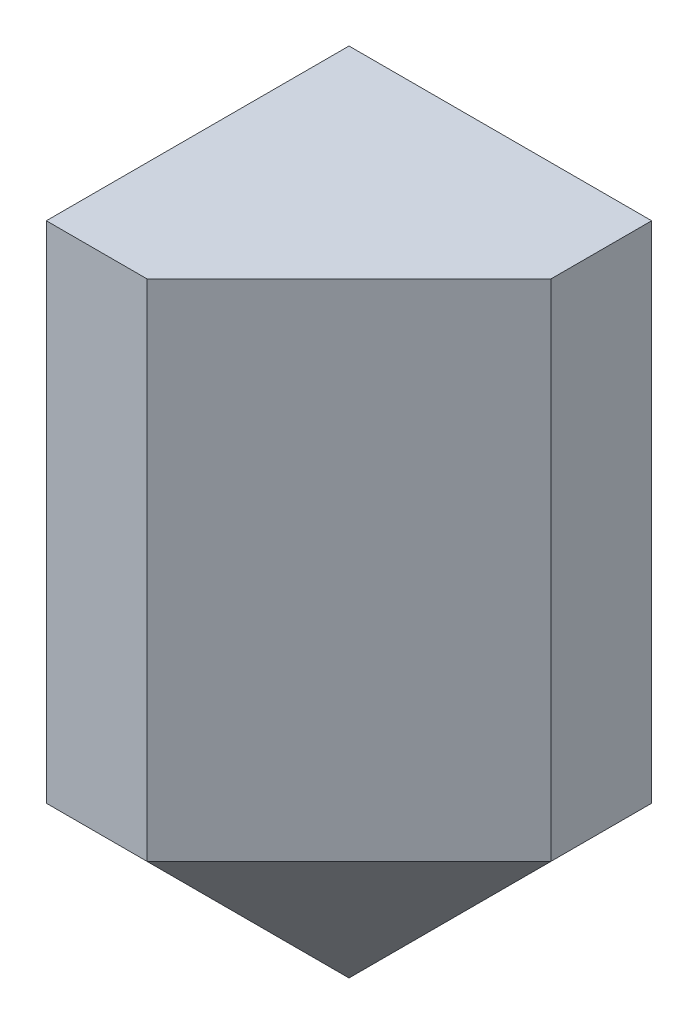
ISO-10303-21;
HEADER;
FILE_DESCRIPTION(('STEP AP214'),'2;1');
FILE_NAME('part.step','',(''),(''),'','','');
FILE_SCHEMA(('AUTOMOTIVE_DESIGN { 1 0 10303 214 1 1 1 1 }'));
ENDSEC;
DATA;
#1=APPLICATION_CONTEXT('core data for automotive mechanical design processes');
#2=APPLICATION_PROTOCOL_DEFINITION('international standard','automotive_design',2000,#1);
#3=PRODUCT_CONTEXT('',#1,'mechanical');
#4=PRODUCT('Part','Part','',(#3));
#5=PRODUCT_RELATED_PRODUCT_CATEGORY('part','',(#4));
#6=PRODUCT_DEFINITION_FORMATION('','',#4);
#7=PRODUCT_DEFINITION_CONTEXT('part definition',#1,'design');
#8=PRODUCT_DEFINITION('design','',#6,#7);
#9=PRODUCT_DEFINITION_SHAPE('','',#8);
#10=(LENGTH_UNIT() NAMED_UNIT(*) SI_UNIT(.MILLI.,.METRE.));
#11=(NAMED_UNIT(*) PLANE_ANGLE_UNIT() SI_UNIT($,.RADIAN.));
#12=(NAMED_UNIT(*) SI_UNIT($,.STERADIAN.) SOLID_ANGLE_UNIT());
#13=UNCERTAINTY_MEASURE_WITH_UNIT(LENGTH_MEASURE(1.E-05),#10,'distance_accuracy_value','');
#14=(GEOMETRIC_REPRESENTATION_CONTEXT(3) GLOBAL_UNCERTAINTY_ASSIGNED_CONTEXT((#13)) GLOBAL_UNIT_ASSIGNED_CONTEXT((#10,
#11,#12)) REPRESENTATION_CONTEXT('',''));
#15=CARTESIAN_POINT('',(0.,0.,0.));
#16=DIRECTION('',(0.,0.,1.));
#17=DIRECTION('',(1.,0.,0.));
#18=AXIS2_PLACEMENT_3D('',#15,#16,#17);
#19=CARTESIAN_POINT('',(0.,0.,30.));
#20=DIRECTION('',(1.,0.,0.));
#21=DIRECTION('',(0.,0.,-1.));
#22=AXIS2_PLACEMENT_3D('',#19,#20,#21);
#23=PLANE('',#22);
#24=CARTESIAN_POINT('',(0.,20.,18.));
#25=DIRECTION('',(-1.,0.,0.));
#26=DIRECTION('',(0.,0.,1.));
#27=AXIS2_PLACEMENT_3D('',#24,#25,#26);
#28=CIRCLE('',#27,2.75);
#29=CARTESIAN_POINT('',(0.,20.,20.75));
#30=VERTEX_POINT('',#29);
#31=EDGE_CURVE('E134',#30,#30,#28,.T.);
#32=ORIENTED_EDGE('',*,*,#31,.F.);
#33=EDGE_LOOP('',(#32));
#34=FACE_BOUND('',#33,.T.);
#35=CARTESIAN_POINT('',(0.,48.,18.));
#36=DIRECTION('',(-1.,0.,0.));
#37=DIRECTION('',(0.,0.,1.));
#38=AXIS2_PLACEMENT_3D('',#35,#36,#37);
#39=CIRCLE('',#38,2.75);
#40=CARTESIAN_POINT('',(0.,48.,20.75));
#41=VERTEX_POINT('',#40);
#42=EDGE_CURVE('E140',#41,#41,#39,.T.);
#43=ORIENTED_EDGE('',*,*,#42,.F.);
#44=EDGE_LOOP('',(#43));
#45=FACE_BOUND('',#44,.T.);
#46=DIRECTION('',(0.,0.,-1.));
#47=VECTOR('',#46,1.);
#48=CARTESIAN_POINT('',(0.,0.,30.));
#49=LINE('',#48,#47);
#50=CARTESIAN_POINT('',(0.,0.,9.99999999999995));
#51=VERTEX_POINT('',#50);
#52=CARTESIAN_POINT('',(0.,0.,0.));
#53=VERTEX_POINT('',#52);
#54=EDGE_CURVE('E165',#51,#53,#49,.T.);
#55=ORIENTED_EDGE('',*,*,#54,.F.);
#56=DIRECTION('',(0.,-0.707106781186546,-0.707106781186549));
#57=VECTOR('',#56,1.);
#58=CARTESIAN_POINT('',(0.,20.,30.));
#59=LINE('',#58,#57);
#60=CARTESIAN_POINT('',(0.,20.,30.));
#61=VERTEX_POINT('',#60);
#62=EDGE_CURVE('E11',#51,#61,#59,.F.);
#63=ORIENTED_EDGE('',*,*,#62,.T.);
#64=DIRECTION('',(0.,-1.,0.));
#65=VECTOR('',#64,1.);
#66=CARTESIAN_POINT('',(0.,0.,30.));
#67=LINE('',#66,#65);
#68=CARTESIAN_POINT('',(0.,70.,30.));
#69=VERTEX_POINT('',#68);
#70=EDGE_CURVE('E162',#69,#61,#67,.T.);
#71=ORIENTED_EDGE('',*,*,#70,.F.);
#72=DIRECTION('',(0.,0.,1.));
#73=VECTOR('',#72,1.);
#74=CARTESIAN_POINT('',(0.,70.,30.));
#75=LINE('',#74,#73);
#76=CARTESIAN_POINT('',(0.,70.,0.));
#77=VERTEX_POINT('',#76);
#78=EDGE_CURVE('E146',#77,#69,#75,.T.);
#79=ORIENTED_EDGE('',*,*,#78,.F.);
#80=DIRECTION('',(0.,-1.,0.));
#81=VECTOR('',#80,1.);
#82=CARTESIAN_POINT('',(0.,0.,0.));
#83=LINE('',#82,#81);
#84=EDGE_CURVE('E167',#77,#53,#83,.T.);
#85=ORIENTED_EDGE('',*,*,#84,.T.);
#86=EDGE_LOOP('',(#55,#63,#71,#79,#85));
#87=FACE_BOUND('',#86,.T.);
#88=ADVANCED_FACE('F41',(#34,#45,#87),#23,.F.);
#89=CARTESIAN_POINT('',(0.,0.,30.));
#90=DIRECTION('',(0.,1.,0.));
#91=DIRECTION('',(0.,0.,1.));
#92=AXIS2_PLACEMENT_3D('',#89,#90,#91);
#93=PLANE('',#92);
#94=DIRECTION('',(1.,0.,0.));
#95=VECTOR('',#94,1.);
#96=CARTESIAN_POINT('',(0.,0.,0.));
#97=LINE('',#96,#95);
#98=CARTESIAN_POINT('',(9.99999999999995,0.,0.));
#99=VERTEX_POINT('',#98);
#100=EDGE_CURVE('E170',#53,#99,#97,.T.);
#101=ORIENTED_EDGE('',*,*,#100,.T.);
#102=DIRECTION('',(0.,0.,1.));
#103=VECTOR('',#102,1.);
#104=CARTESIAN_POINT('',(9.99999999999995,0.,30.));
#105=LINE('',#104,#103);
#106=CARTESIAN_POINT('',(9.99999999999995,0.,9.99999999999995));
#107=VERTEX_POINT('',#106);
#108=EDGE_CURVE('E51',#99,#107,#105,.T.);
#109=ORIENTED_EDGE('',*,*,#108,.T.);
#110=DIRECTION('',(-1.,0.,0.));
#111=VECTOR('',#110,1.);
#112=CARTESIAN_POINT('',(0.,0.,9.99999999999995));
#113=LINE('',#112,#111);
#114=EDGE_CURVE('E62',#107,#51,#113,.T.);
#115=ORIENTED_EDGE('',*,*,#114,.T.);
#116=ORIENTED_EDGE('',*,*,#54,.T.);
#117=EDGE_LOOP('',(#101,#109,#115,#116));
#118=FACE_BOUND('',#117,.T.);
#119=ADVANCED_FACE('F223',(#118),#93,.F.);
#120=CARTESIAN_POINT('',(30.,0.,30.));
#121=DIRECTION('',(-1.,0.,0.));
#122=DIRECTION('',(0.,0.,1.));
#123=AXIS2_PLACEMENT_3D('',#120,#121,#122);
#124=PLANE('',#123);
#125=DIRECTION('',(0.,1.,0.));
#126=VECTOR('',#125,1.);
#127=CARTESIAN_POINT('',(30.,0.,0.));
#128=LINE('',#127,#126);
#129=CARTESIAN_POINT('',(30.,20.,0.));
#130=VERTEX_POINT('',#129);
#131=CARTESIAN_POINT('',(30.,70.,0.));
#132=VERTEX_POINT('',#131);
#133=EDGE_CURVE('E166',#130,#132,#128,.T.);
#134=ORIENTED_EDGE('',*,*,#133,.T.);
#135=DIRECTION('',(0.,0.,-1.));
#136=VECTOR('',#135,1.);
#137=CARTESIAN_POINT('',(30.,70.,0.));
#138=LINE('',#137,#136);
#139=CARTESIAN_POINT('',(30.,70.,9.99999999999992));
#140=VERTEX_POINT('',#139);
#141=EDGE_CURVE('E155',#140,#132,#138,.T.);
#142=ORIENTED_EDGE('',*,*,#141,.F.);
#143=DIRECTION('',(0.,-1.,0.));
#144=VECTOR('',#143,1.);
#145=CARTESIAN_POINT('',(30.,0.,9.99999999999995));
#146=LINE('',#145,#144);
#147=CARTESIAN_POINT('',(30.,20.,9.99999999999995));
#148=VERTEX_POINT('',#147);
#149=EDGE_CURVE('E180',#140,#148,#146,.T.);
#150=ORIENTED_EDGE('',*,*,#149,.T.);
#151=DIRECTION('',(0.,0.,-1.));
#152=VECTOR('',#151,1.);
#153=CARTESIAN_POINT('',(30.,20.,30.));
#154=LINE('',#153,#152);
#155=EDGE_CURVE('E178',#148,#130,#154,.T.);
#156=ORIENTED_EDGE('',*,*,#155,.T.);
#157=EDGE_LOOP('',(#134,#142,#150,#156));
#158=FACE_BOUND('',#157,.T.);
#159=ADVANCED_FACE('F229',(#158),#124,.F.);
#160=CARTESIAN_POINT('',(0.,0.,30.));
#161=DIRECTION('',(0.,0.,-1.));
#162=DIRECTION('',(-1.,0.,0.));
#163=AXIS2_PLACEMENT_3D('',#160,#161,#162);
#164=PLANE('',#163);
#165=DIRECTION('',(1.,0.,0.));
#166=VECTOR('',#165,1.);
#167=CARTESIAN_POINT('',(0.,20.,30.));
#168=LINE('',#167,#166);
#169=CARTESIAN_POINT('',(10.,20.,30.));
#170=VERTEX_POINT('',#169);
#171=EDGE_CURVE('E174',#61,#170,#168,.T.);
#172=ORIENTED_EDGE('',*,*,#171,.T.);
#173=DIRECTION('',(0.,1.,0.));
#174=VECTOR('',#173,1.);
#175=CARTESIAN_POINT('',(10.,0.,30.));
#176=LINE('',#175,#174);
#177=CARTESIAN_POINT('',(9.99999999999999,70.,30.));
#178=VERTEX_POINT('',#177);
#179=EDGE_CURVE('E176',#170,#178,#176,.T.);
#180=ORIENTED_EDGE('',*,*,#179,.T.);
#181=DIRECTION('',(1.,0.,0.));
#182=VECTOR('',#181,1.);
#183=CARTESIAN_POINT('',(9.99999999999999,70.,30.));
#184=LINE('',#183,#182);
#185=EDGE_CURVE('E149',#69,#178,#184,.T.);
#186=ORIENTED_EDGE('',*,*,#185,.F.);
#187=ORIENTED_EDGE('',*,*,#70,.T.);
#188=EDGE_LOOP('',(#172,#180,#186,#187));
#189=FACE_BOUND('',#188,.T.);
#190=ADVANCED_FACE('F203',(#189),#164,.F.);
#191=CARTESIAN_POINT('',(0.,0.,0.));
#192=DIRECTION('',(0.,0.,-1.));
#193=DIRECTION('',(-1.,0.,0.));
#194=AXIS2_PLACEMENT_3D('',#191,#192,#193);
#195=PLANE('',#194);
#196=CARTESIAN_POINT('',(15.,55.,0.));
#197=DIRECTION('',(0.,0.,-1.));
#198=DIRECTION('',(-1.,0.,0.));
#199=AXIS2_PLACEMENT_3D('',#196,#197,#198);
#200=CIRCLE('',#199,7.5);
#201=CARTESIAN_POINT('',(7.5,55.,0.));
#202=VERTEX_POINT('',#201);
#203=EDGE_CURVE('E117',#202,#202,#200,.T.);
#204=ORIENTED_EDGE('',*,*,#203,.F.);
#205=EDGE_LOOP('',(#204));
#206=FACE_BOUND('',#205,.T.);
#207=CARTESIAN_POINT('',(18.,20.,0.));
#208=DIRECTION('',(0.,0.,-1.));
#209=DIRECTION('',(-1.,0.,0.));
#210=AXIS2_PLACEMENT_3D('',#207,#208,#209);
#211=CIRCLE('',#210,2.74999999999999);
#212=CARTESIAN_POINT('',(15.25,20.,0.));
#213=VERTEX_POINT('',#212);
#214=EDGE_CURVE('E127',#213,#213,#211,.T.);
#215=ORIENTED_EDGE('',*,*,#214,.F.);
#216=EDGE_LOOP('',(#215));
#217=FACE_BOUND('',#216,.T.);
#218=ORIENTED_EDGE('',*,*,#133,.F.);
#219=DIRECTION('',(0.707106781186549,0.707106781186546,0.));
#220=VECTOR('',#219,1.);
#221=CARTESIAN_POINT('',(4.99999999999996,-4.99999999999997,0.));
#222=LINE('',#221,#220);
#223=EDGE_CURVE('E182',#130,#99,#222,.F.);
#224=ORIENTED_EDGE('',*,*,#223,.T.);
#225=ORIENTED_EDGE('',*,*,#100,.F.);
#226=ORIENTED_EDGE('',*,*,#84,.F.);
#227=DIRECTION('',(-1.,0.,0.));
#228=VECTOR('',#227,1.);
#229=CARTESIAN_POINT('',(0.,70.,0.));
#230=LINE('',#229,#228);
#231=EDGE_CURVE('E158',#132,#77,#230,.T.);
#232=ORIENTED_EDGE('',*,*,#231,.F.);
#233=EDGE_LOOP('',(#218,#224,#225,#226,#232));
#234=FACE_BOUND('',#233,.T.);
#235=ADVANCED_FACE('F220',(#206,#217,#234),#195,.T.);
#236=CARTESIAN_POINT('',(30.,20.,30.));
#237=DIRECTION('',(-0.707106781186546,0.707106781186549,0.));
#238=DIRECTION('',(0.,0.,-1.));
#239=AXIS2_PLACEMENT_3D('',#236,#237,#238);
#240=PLANE('',#239);
#241=ORIENTED_EDGE('',*,*,#223,.F.);
#242=ORIENTED_EDGE('',*,*,#155,.F.);
#243=DIRECTION('',(-0.707106781186549,-0.707106781186546,0.));
#244=VECTOR('',#243,1.);
#245=CARTESIAN_POINT('',(30.,20.,9.99999999999995));
#246=LINE('',#245,#244);
#247=EDGE_CURVE('E46',#107,#148,#246,.F.);
#248=ORIENTED_EDGE('',*,*,#247,.F.);
#249=ORIENTED_EDGE('',*,*,#108,.F.);
#250=EDGE_LOOP('',(#241,#242,#248,#249));
#251=FACE_BOUND('',#250,.T.);
#252=ADVANCED_FACE('F44',(#251),#240,.F.);
#253=CARTESIAN_POINT('',(0.,20.,30.));
#254=DIRECTION('',(0.,0.707106781186549,-0.707106781186546));
#255=DIRECTION('',(1.,0.,0.));
#256=AXIS2_PLACEMENT_3D('',#253,#254,#255);
#257=PLANE('',#256);
#258=ORIENTED_EDGE('',*,*,#62,.F.);
#259=ORIENTED_EDGE('',*,*,#114,.F.);
#260=DIRECTION('',(0.,0.707106781186546,0.707106781186549));
#261=VECTOR('',#260,1.);
#262=CARTESIAN_POINT('',(9.99999999999998,10.,20.));
#263=LINE('',#262,#261);
#264=EDGE_CURVE('E187',#170,#107,#263,.F.);
#265=ORIENTED_EDGE('',*,*,#264,.F.);
#266=ORIENTED_EDGE('',*,*,#171,.F.);
#267=EDGE_LOOP('',(#258,#259,#265,#266));
#268=FACE_BOUND('',#267,.T.);
#269=ADVANCED_FACE('F213',(#268),#257,.F.);
#270=CARTESIAN_POINT('',(30.,20.,9.99999999999995));
#271=DIRECTION('',(0.577350269189626,-0.577350269189628,0.577350269189624));
#272=DIRECTION('',(0.707106781186549,0.707106781186546,0.));
#273=AXIS2_PLACEMENT_3D('',#270,#271,#272);
#274=PLANE('',#273);
#275=ORIENTED_EDGE('',*,*,#264,.T.);
#276=ORIENTED_EDGE('',*,*,#247,.T.);
#277=DIRECTION('',(0.707106781186546,0.,-0.707106781186549));
#278=VECTOR('',#277,1.);
#279=CARTESIAN_POINT('',(30.,20.,9.99999999999995));
#280=LINE('',#279,#278);
#281=EDGE_CURVE('E161',#170,#148,#280,.T.);
#282=ORIENTED_EDGE('',*,*,#281,.F.);
#283=EDGE_LOOP('',(#275,#276,#282));
#284=FACE_BOUND('',#283,.T.);
#285=ADVANCED_FACE('F194',(#284),#274,.T.);
#286=CARTESIAN_POINT('',(10.,0.,30.));
#287=DIRECTION('',(-0.707106781186549,0.,-0.707106781186546));
#288=DIRECTION('',(0.,1.,0.));
#289=AXIS2_PLACEMENT_3D('',#286,#287,#288);
#290=PLANE('',#289);
#291=ORIENTED_EDGE('',*,*,#281,.T.);
#292=ORIENTED_EDGE('',*,*,#149,.F.);
#293=DIRECTION('',(0.707106781186546,0.,-0.707106781186549));
#294=VECTOR('',#293,1.);
#295=CARTESIAN_POINT('',(30.,70.,9.99999999999992));
#296=LINE('',#295,#294);
#297=EDGE_CURVE('E152',#178,#140,#296,.T.);
#298=ORIENTED_EDGE('',*,*,#297,.F.);
#299=ORIENTED_EDGE('',*,*,#179,.F.);
#300=EDGE_LOOP('',(#291,#292,#298,#299));
#301=FACE_BOUND('',#300,.T.);
#302=ADVANCED_FACE('F199',(#301),#290,.F.);
#303=CARTESIAN_POINT('',(0.,70.,0.));
#304=DIRECTION('',(0.,-1.,0.));
#305=DIRECTION('',(0.,0.,-1.));
#306=AXIS2_PLACEMENT_3D('',#303,#304,#305);
#307=PLANE('',#306);
#308=ORIENTED_EDGE('',*,*,#78,.T.);
#309=ORIENTED_EDGE('',*,*,#185,.T.);
#310=ORIENTED_EDGE('',*,*,#297,.T.);
#311=ORIENTED_EDGE('',*,*,#141,.T.);
#312=ORIENTED_EDGE('',*,*,#231,.T.);
#313=EDGE_LOOP('',(#308,#309,#310,#311,#312));
#314=FACE_BOUND('',#313,.T.);
#315=ADVANCED_FACE('F206',(#314),#307,.F.);
#316=CARTESIAN_POINT('',(13.,48.,18.));
#317=DIRECTION('',(-1.,0.,0.));
#318=DIRECTION('',(0.,0.,1.));
#319=AXIS2_PLACEMENT_3D('',#316,#317,#318);
#320=CONICAL_SURFACE('',#319,2.75,1.02974425867665);
#321=CARTESIAN_POINT('',(14.6523667023258,48.,18.));
#322=VERTEX_POINT('',#321);
#323=VERTEX_LOOP('',#322);
#324=FACE_BOUND('',#323,.T.);
#325=CARTESIAN_POINT('',(13.,48.,18.));
#326=DIRECTION('',(-1.,0.,0.));
#327=DIRECTION('',(0.,0.,1.));
#328=AXIS2_PLACEMENT_3D('',#325,#326,#327);
#329=CIRCLE('',#328,2.75);
#330=CARTESIAN_POINT('',(13.,48.,20.75));
#331=VERTEX_POINT('',#330);
#332=EDGE_CURVE('E143',#331,#331,#329,.T.);
#333=ORIENTED_EDGE('',*,*,#332,.T.);
#334=EDGE_LOOP('',(#333));
#335=FACE_BOUND('',#334,.T.);
#336=ADVANCED_FACE('F249',(#324,#335),#320,.F.);
#337=CARTESIAN_POINT('',(0.,48.,18.));
#338=DIRECTION('',(-1.,0.,0.));
#339=DIRECTION('',(0.,0.,1.));
#340=AXIS2_PLACEMENT_3D('',#337,#338,#339);
#341=CYLINDRICAL_SURFACE('',#340,2.75);
#342=ORIENTED_EDGE('',*,*,#332,.F.);
#343=EDGE_LOOP('',(#342));
#344=FACE_BOUND('',#343,.T.);
#345=ORIENTED_EDGE('',*,*,#42,.T.);
#346=EDGE_LOOP('',(#345));
#347=FACE_BOUND('',#346,.T.);
#348=ADVANCED_FACE('F254',(#344,#347),#341,.F.);
#349=CARTESIAN_POINT('',(13.,20.,18.));
#350=DIRECTION('',(-1.,0.,0.));
#351=DIRECTION('',(0.,0.,1.));
#352=AXIS2_PLACEMENT_3D('',#349,#350,#351);
#353=CONICAL_SURFACE('',#352,2.75,1.02974425867665);
#354=CARTESIAN_POINT('',(14.6523667023258,20.,18.));
#355=VERTEX_POINT('',#354);
#356=VERTEX_LOOP('',#355);
#357=FACE_BOUND('',#356,.T.);
#358=CARTESIAN_POINT('',(13.,20.,18.));
#359=DIRECTION('',(-1.,0.,0.));
#360=DIRECTION('',(0.,0.,1.));
#361=AXIS2_PLACEMENT_3D('',#358,#359,#360);
#362=CIRCLE('',#361,2.75);
#363=CARTESIAN_POINT('',(13.,20.,20.75));
#364=VERTEX_POINT('',#363);
#365=EDGE_CURVE('E137',#364,#364,#362,.T.);
#366=ORIENTED_EDGE('',*,*,#365,.T.);
#367=EDGE_LOOP('',(#366));
#368=FACE_BOUND('',#367,.T.);
#369=ADVANCED_FACE('F366',(#357,#368),#353,.F.);
#370=CARTESIAN_POINT('',(0.,20.,18.));
#371=DIRECTION('',(-1.,0.,0.));
#372=DIRECTION('',(0.,0.,1.));
#373=AXIS2_PLACEMENT_3D('',#370,#371,#372);
#374=CYLINDRICAL_SURFACE('',#373,2.75);
#375=ORIENTED_EDGE('',*,*,#365,.F.);
#376=EDGE_LOOP('',(#375));
#377=FACE_BOUND('',#376,.T.);
#378=ORIENTED_EDGE('',*,*,#31,.T.);
#379=EDGE_LOOP('',(#378));
#380=FACE_BOUND('',#379,.T.);
#381=ADVANCED_FACE('F376',(#377,#380),#374,.F.);
#382=CARTESIAN_POINT('',(18.,20.,13.));
#383=DIRECTION('',(0.,0.,-1.));
#384=DIRECTION('',(-1.,0.,0.));
#385=AXIS2_PLACEMENT_3D('',#382,#383,#384);
#386=CONICAL_SURFACE('',#385,2.75,1.02974425867665);
#387=CARTESIAN_POINT('',(18.,20.,14.6523667023258));
#388=VERTEX_POINT('',#387);
#389=VERTEX_LOOP('',#388);
#390=FACE_BOUND('',#389,.T.);
#391=CARTESIAN_POINT('',(18.,20.,13.));
#392=DIRECTION('',(0.,0.,-1.));
#393=DIRECTION('',(-1.,0.,0.));
#394=AXIS2_PLACEMENT_3D('',#391,#392,#393);
#395=CIRCLE('',#394,2.75);
#396=CARTESIAN_POINT('',(15.25,20.,13.));
#397=VERTEX_POINT('',#396);
#398=EDGE_CURVE('E131',#397,#397,#395,.T.);
#399=ORIENTED_EDGE('',*,*,#398,.T.);
#400=EDGE_LOOP('',(#399));
#401=FACE_BOUND('',#400,.T.);
#402=ADVANCED_FACE('F387',(#390,#401),#386,.F.);
#403=CARTESIAN_POINT('',(18.,20.,0.));
#404=DIRECTION('',(0.,0.,-1.));
#405=DIRECTION('',(-1.,0.,0.));
#406=AXIS2_PLACEMENT_3D('',#403,#404,#405);
#407=CYLINDRICAL_SURFACE('',#406,2.74999999999999);
#408=ORIENTED_EDGE('',*,*,#398,.F.);
#409=EDGE_LOOP('',(#408));
#410=FACE_BOUND('',#409,.T.);
#411=ORIENTED_EDGE('',*,*,#214,.T.);
#412=EDGE_LOOP('',(#411));
#413=FACE_BOUND('',#412,.T.);
#414=ADVANCED_FACE('F397',(#410,#413),#407,.F.);
#415=CARTESIAN_POINT('',(15.,55.,3.));
#416=DIRECTION('',(0.,0.,-1.));
#417=DIRECTION('',(-1.,0.,0.));
#418=AXIS2_PLACEMENT_3D('',#415,#416,#417);
#419=CYLINDRICAL_SURFACE('',#418,7.5);
#420=CARTESIAN_POINT('',(15.,55.,3.));
#421=DIRECTION('',(0.,0.,-1.));
#422=DIRECTION('',(-1.,0.,0.));
#423=AXIS2_PLACEMENT_3D('',#420,#421,#422);
#424=CIRCLE('',#423,7.5);
#425=CARTESIAN_POINT('',(7.5,55.,3.));
#426=VERTEX_POINT('',#425);
#427=EDGE_CURVE('E121',#426,#426,#424,.T.);
#428=ORIENTED_EDGE('',*,*,#427,.F.);
#429=EDGE_LOOP('',(#428));
#430=FACE_BOUND('',#429,.T.);
#431=ORIENTED_EDGE('',*,*,#203,.T.);
#432=EDGE_LOOP('',(#431));
#433=FACE_BOUND('',#432,.T.);
#434=ADVANCED_FACE('F407',(#430,#433),#419,.F.);
#435=CARTESIAN_POINT('',(15.,55.,3.));
#436=DIRECTION('',(0.,0.,-1.));
#437=DIRECTION('',(-1.,0.,0.));
#438=AXIS2_PLACEMENT_3D('',#435,#436,#437);
#439=PLANE('',#438);
#440=CARTESIAN_POINT('',(15.,55.,3.));
#441=DIRECTION('',(0.,0.,-1.));
#442=DIRECTION('',(-1.,0.,0.));
#443=AXIS2_PLACEMENT_3D('',#440,#441,#442);
#444=CIRCLE('',#443,2.25);
#445=CARTESIAN_POINT('',(12.75,55.,3.));
#446=VERTEX_POINT('',#445);
#447=EDGE_CURVE('E118',#446,#446,#444,.T.);
#448=ORIENTED_EDGE('',*,*,#447,.F.);
#449=EDGE_LOOP('',(#448));
#450=FACE_BOUND('',#449,.T.);
#451=ORIENTED_EDGE('',*,*,#427,.T.);
#452=EDGE_LOOP('',(#451));
#453=FACE_BOUND('',#452,.T.);
#454=ADVANCED_FACE('F111',(#450,#453),#439,.T.);
#455=CARTESIAN_POINT('',(15.,55.,13.));
#456=DIRECTION('',(0.,0.,-1.));
#457=DIRECTION('',(-1.,0.,0.));
#458=AXIS2_PLACEMENT_3D('',#455,#456,#457);
#459=CONICAL_SURFACE('',#458,2.25,1.02974425867665);
#460=CARTESIAN_POINT('',(15.,55.,14.351936392812));
#461=VERTEX_POINT('',#460);
#462=VERTEX_LOOP('',#461);
#463=FACE_BOUND('',#462,.T.);
#464=CARTESIAN_POINT('',(15.,55.,13.));
#465=DIRECTION('',(0.,0.,-1.));
#466=DIRECTION('',(-1.,0.,0.));
#467=AXIS2_PLACEMENT_3D('',#464,#465,#466);
#468=CIRCLE('',#467,2.25);
#469=CARTESIAN_POINT('',(12.75,55.,13.));
#470=VERTEX_POINT('',#469);
#471=EDGE_CURVE('E115',#470,#470,#468,.T.);
#472=ORIENTED_EDGE('',*,*,#471,.T.);
#473=EDGE_LOOP('',(#472));
#474=FACE_BOUND('',#473,.T.);
#475=ADVANCED_FACE('F107',(#463,#474),#459,.F.);
#476=CARTESIAN_POINT('',(15.,55.,3.));
#477=DIRECTION('',(0.,0.,-1.));
#478=DIRECTION('',(-1.,0.,0.));
#479=AXIS2_PLACEMENT_3D('',#476,#477,#478);
#480=CYLINDRICAL_SURFACE('',#479,2.25);
#481=ORIENTED_EDGE('',*,*,#471,.F.);
#482=EDGE_LOOP('',(#481));
#483=FACE_BOUND('',#482,.T.);
#484=ORIENTED_EDGE('',*,*,#447,.T.);
#485=EDGE_LOOP('',(#484));
#486=FACE_BOUND('',#485,.T.);
#487=ADVANCED_FACE('F110',(#483,#486),#480,.F.);
#488=CLOSED_SHELL('',(#88,#119,#159,#190,#235,#252,#269,#285,#302,#315,#336,#348,#369,#381,#402,
#414,#434,#454,#475,#487));
#489=MANIFOLD_SOLID_BREP('B2',#488);
#490=ADVANCED_BREP_SHAPE_REPRESENTATION('',(#18,#489),#14);
#491=SHAPE_DEFINITION_REPRESENTATION(#9,#490);
ENDSEC;
END-ISO-10303-21;
